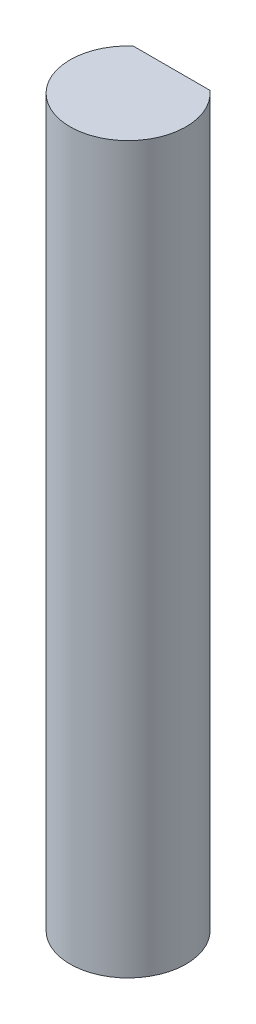
ISO-10303-21;
HEADER;
FILE_DESCRIPTION(('STEP AP214'),'2;1');
FILE_NAME('part.step','',(''),(''),'','','');
FILE_SCHEMA(('AUTOMOTIVE_DESIGN { 1 0 10303 214 1 1 1 1 }'));
ENDSEC;
DATA;
#1=APPLICATION_CONTEXT('core data for automotive mechanical design processes');
#2=APPLICATION_PROTOCOL_DEFINITION('international standard','automotive_design',2000,#1);
#3=PRODUCT_CONTEXT('',#1,'mechanical');
#4=PRODUCT('Part','Part','',(#3));
#5=PRODUCT_RELATED_PRODUCT_CATEGORY('part','',(#4));
#6=PRODUCT_DEFINITION_FORMATION('','',#4);
#7=PRODUCT_DEFINITION_CONTEXT('part definition',#1,'design');
#8=PRODUCT_DEFINITION('design','',#6,#7);
#9=PRODUCT_DEFINITION_SHAPE('','',#8);
#10=(LENGTH_UNIT() NAMED_UNIT(*) SI_UNIT(.MILLI.,.METRE.));
#11=(NAMED_UNIT(*) PLANE_ANGLE_UNIT() SI_UNIT($,.RADIAN.));
#12=(NAMED_UNIT(*) SI_UNIT($,.STERADIAN.) SOLID_ANGLE_UNIT());
#13=UNCERTAINTY_MEASURE_WITH_UNIT(LENGTH_MEASURE(1.E-05),#10,'distance_accuracy_value','');
#14=(GEOMETRIC_REPRESENTATION_CONTEXT(3) GLOBAL_UNCERTAINTY_ASSIGNED_CONTEXT((#13)) GLOBAL_UNIT_ASSIGNED_CONTEXT((#10,
#11,#12)) REPRESENTATION_CONTEXT('',''));
#15=CARTESIAN_POINT('',(0.,0.,0.));
#16=DIRECTION('',(0.,0.,1.));
#17=DIRECTION('',(1.,0.,0.));
#18=AXIS2_PLACEMENT_3D('',#15,#16,#17);
#19=CARTESIAN_POINT('',(0.,25.,0.));
#20=DIRECTION('',(0.,-1.,0.));
#21=DIRECTION('',(0.,0.,-1.));
#22=AXIS2_PLACEMENT_3D('',#19,#20,#21);
#23=CYLINDRICAL_SURFACE('',#22,2.);
#24=CARTESIAN_POINT('',(0.,0.,0.));
#25=DIRECTION('',(0.,1.,0.));
#26=DIRECTION('',(0.,0.,1.));
#27=AXIS2_PLACEMENT_3D('',#24,#25,#26);
#28=CIRCLE('',#27,2.);
#29=CARTESIAN_POINT('',(-1.3228756555323,0.,-1.5));
#30=VERTEX_POINT('',#29);
#31=CARTESIAN_POINT('',(1.3228756555323,0.,-1.5));
#32=VERTEX_POINT('',#31);
#33=EDGE_CURVE('E72',#30,#32,#28,.T.);
#34=ORIENTED_EDGE('',*,*,#33,.T.);
#35=DIRECTION('',(0.,-1.,0.));
#36=VECTOR('',#35,1.);
#37=CARTESIAN_POINT('',(1.3228756555323,25.,-1.5));
#38=LINE('',#37,#36);
#39=CARTESIAN_POINT('',(1.3228756555323,25.,-1.5));
#40=VERTEX_POINT('',#39);
#41=EDGE_CURVE('E11',#40,#32,#38,.T.);
#42=ORIENTED_EDGE('',*,*,#41,.F.);
#43=CARTESIAN_POINT('',(0.,25.,0.));
#44=DIRECTION('',(0.,1.,0.));
#45=DIRECTION('',(0.,0.,1.));
#46=AXIS2_PLACEMENT_3D('',#43,#44,#45);
#47=CIRCLE('',#46,2.);
#48=CARTESIAN_POINT('',(-1.3228756555323,25.,-1.5));
#49=VERTEX_POINT('',#48);
#50=EDGE_CURVE('E71',#49,#40,#47,.T.);
#51=ORIENTED_EDGE('',*,*,#50,.F.);
#52=DIRECTION('',(0.,-1.,0.));
#53=VECTOR('',#52,1.);
#54=CARTESIAN_POINT('',(-1.3228756555323,25.,-1.5));
#55=LINE('',#54,#53);
#56=EDGE_CURVE('E48',#49,#30,#55,.T.);
#57=ORIENTED_EDGE('',*,*,#56,.T.);
#58=EDGE_LOOP('',(#34,#42,#51,#57));
#59=FACE_BOUND('',#58,.T.);
#60=ADVANCED_FACE('F39',(#59),#23,.T.);
#61=CARTESIAN_POINT('',(-1.3228756555323,25.,-1.5));
#62=DIRECTION('',(0.,0.,1.));
#63=DIRECTION('',(1.,0.,0.));
#64=AXIS2_PLACEMENT_3D('',#61,#62,#63);
#65=PLANE('',#64);
#66=DIRECTION('',(-1.,0.,0.));
#67=VECTOR('',#66,1.);
#68=CARTESIAN_POINT('',(-1.3228756555323,0.,-1.5));
#69=LINE('',#68,#67);
#70=EDGE_CURVE('E63',#32,#30,#69,.T.);
#71=ORIENTED_EDGE('',*,*,#70,.T.);
#72=ORIENTED_EDGE('',*,*,#56,.F.);
#73=DIRECTION('',(-1.,0.,0.));
#74=VECTOR('',#73,1.);
#75=CARTESIAN_POINT('',(-1.3228756555323,25.,-1.5));
#76=LINE('',#75,#74);
#77=EDGE_CURVE('E55',#40,#49,#76,.T.);
#78=ORIENTED_EDGE('',*,*,#77,.F.);
#79=ORIENTED_EDGE('',*,*,#41,.T.);
#80=EDGE_LOOP('',(#71,#72,#78,#79));
#81=FACE_BOUND('',#80,.T.);
#82=ADVANCED_FACE('F66',(#81),#65,.F.);
#83=CARTESIAN_POINT('',(0.,25.,0.));
#84=DIRECTION('',(0.,1.,0.));
#85=DIRECTION('',(0.,0.,1.));
#86=AXIS2_PLACEMENT_3D('',#83,#84,#85);
#87=PLANE('',#86);
#88=ORIENTED_EDGE('',*,*,#50,.T.);
#89=ORIENTED_EDGE('',*,*,#77,.T.);
#90=EDGE_LOOP('',(#88,#89));
#91=FACE_BOUND('',#90,.T.);
#92=ADVANCED_FACE('F83',(#91),#87,.T.);
#93=CARTESIAN_POINT('',(0.,0.,0.));
#94=DIRECTION('',(0.,1.,0.));
#95=DIRECTION('',(0.,0.,1.));
#96=AXIS2_PLACEMENT_3D('',#93,#94,#95);
#97=PLANE('',#96);
#98=ORIENTED_EDGE('',*,*,#33,.F.);
#99=ORIENTED_EDGE('',*,*,#70,.F.);
#100=EDGE_LOOP('',(#98,#99));
#101=FACE_BOUND('',#100,.T.);
#102=ADVANCED_FACE('F76',(#101),#97,.F.);
#103=CLOSED_SHELL('',(#60,#82,#92,#102));
#104=MANIFOLD_SOLID_BREP('B2',#103);
#105=ADVANCED_BREP_SHAPE_REPRESENTATION('',(#18,#104),#14);
#106=SHAPE_DEFINITION_REPRESENTATION(#9,#105);
ENDSEC;
END-ISO-10303-21;
